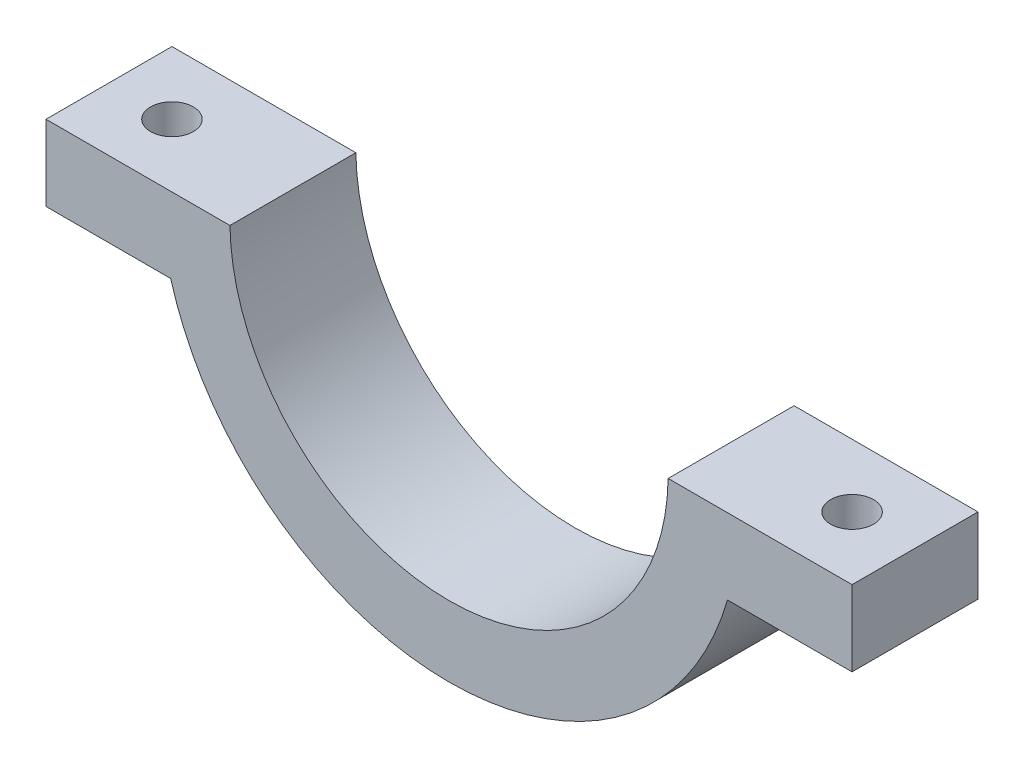
ISO-10303-21;
HEADER;
FILE_DESCRIPTION(('STEP AP214'),'2;1');
FILE_NAME('part.step','',(''),(''),'','','');
FILE_SCHEMA(('AUTOMOTIVE_DESIGN { 1 0 10303 214 1 1 1 1 }'));
ENDSEC;
DATA;
#1=APPLICATION_CONTEXT('core data for automotive mechanical design processes');
#2=APPLICATION_PROTOCOL_DEFINITION('international standard','automotive_design',2000,#1);
#3=PRODUCT_CONTEXT('',#1,'mechanical');
#4=PRODUCT('Part','Part','',(#3));
#5=PRODUCT_RELATED_PRODUCT_CATEGORY('part','',(#4));
#6=PRODUCT_DEFINITION_FORMATION('','',#4);
#7=PRODUCT_DEFINITION_CONTEXT('part definition',#1,'design');
#8=PRODUCT_DEFINITION('design','',#6,#7);
#9=PRODUCT_DEFINITION_SHAPE('','',#8);
#10=(LENGTH_UNIT() NAMED_UNIT(*) SI_UNIT(.MILLI.,.METRE.));
#11=(NAMED_UNIT(*) PLANE_ANGLE_UNIT() SI_UNIT($,.RADIAN.));
#12=(NAMED_UNIT(*) SI_UNIT($,.STERADIAN.) SOLID_ANGLE_UNIT());
#13=UNCERTAINTY_MEASURE_WITH_UNIT(LENGTH_MEASURE(1.E-05),#10,'distance_accuracy_value','');
#14=(GEOMETRIC_REPRESENTATION_CONTEXT(3) GLOBAL_UNCERTAINTY_ASSIGNED_CONTEXT((#13)) GLOBAL_UNIT_ASSIGNED_CONTEXT((#10,
#11,#12)) REPRESENTATION_CONTEXT('',''));
#15=CARTESIAN_POINT('',(0.,0.,0.));
#16=DIRECTION('',(0.,0.,1.));
#17=DIRECTION('',(1.,0.,0.));
#18=AXIS2_PLACEMENT_3D('',#15,#16,#17);
#19=CARTESIAN_POINT('',(32.,-0.3,10.));
#20=DIRECTION('',(0.,-1.,0.));
#21=DIRECTION('',(0.,0.,-1.));
#22=AXIS2_PLACEMENT_3D('',#19,#20,#21);
#23=PLANE('',#22);
#24=CARTESIAN_POINT('',(-27.,-0.3,5.));
#25=DIRECTION('',(0.,-1.,0.));
#26=DIRECTION('',(0.,0.,-1.));
#27=AXIS2_PLACEMENT_3D('',#24,#25,#26);
#28=CIRCLE('',#27,1.7);
#29=CARTESIAN_POINT('',(-27.,-0.3,3.3));
#30=VERTEX_POINT('',#29);
#31=EDGE_CURVE('E164',#30,#30,#28,.F.);
#32=ORIENTED_EDGE('',*,*,#31,.F.);
#33=EDGE_LOOP('',(#32));
#34=FACE_BOUND('',#33,.T.);
#35=DIRECTION('',(0.,0.,-1.));
#36=VECTOR('',#35,1.);
#37=CARTESIAN_POINT('',(-17.3974136008776,-0.3,10.2));
#38=LINE('',#37,#36);
#39=CARTESIAN_POINT('',(-17.3974136008776,-0.3,0.));
#40=VERTEX_POINT('',#39);
#41=CARTESIAN_POINT('',(-17.3974136008776,-0.3,10.));
#42=VERTEX_POINT('',#41);
#43=EDGE_CURVE('E168',#40,#42,#38,.F.);
#44=ORIENTED_EDGE('',*,*,#43,.F.);
#45=DIRECTION('',(-1.,0.,0.));
#46=VECTOR('',#45,1.);
#47=CARTESIAN_POINT('',(32.,-0.3,0.));
#48=LINE('',#47,#46);
#49=CARTESIAN_POINT('',(-32.,-0.3,0.));
#50=VERTEX_POINT('',#49);
#51=EDGE_CURVE('E139',#40,#50,#48,.T.);
#52=ORIENTED_EDGE('',*,*,#51,.T.);
#53=DIRECTION('',(0.,0.,-1.));
#54=VECTOR('',#53,1.);
#55=CARTESIAN_POINT('',(-32.,-0.3,10.));
#56=LINE('',#55,#54);
#57=CARTESIAN_POINT('',(-32.,-0.3,10.));
#58=VERTEX_POINT('',#57);
#59=EDGE_CURVE('E50',#58,#50,#56,.T.);
#60=ORIENTED_EDGE('',*,*,#59,.F.);
#61=DIRECTION('',(-1.,0.,0.));
#62=VECTOR('',#61,1.);
#63=CARTESIAN_POINT('',(32.,-0.3,10.));
#64=LINE('',#63,#62);
#65=EDGE_CURVE('E98',#42,#58,#64,.T.);
#66=ORIENTED_EDGE('',*,*,#65,.F.);
#67=EDGE_LOOP('',(#44,#52,#60,#66));
#68=FACE_BOUND('',#67,.T.);
#69=ADVANCED_FACE('F39',(#34,#68),#23,.F.);
#70=CARTESIAN_POINT('',(27.,-0.3,5.));
#71=DIRECTION('',(0.,-1.,0.));
#72=DIRECTION('',(0.,0.,-1.));
#73=AXIS2_PLACEMENT_3D('',#70,#71,#72);
#74=CIRCLE('',#73,1.7);
#75=CARTESIAN_POINT('',(27.,-0.3,3.3));
#76=VERTEX_POINT('',#75);
#77=EDGE_CURVE('E160',#76,#76,#74,.F.);
#78=ORIENTED_EDGE('',*,*,#77,.F.);
#79=EDGE_LOOP('',(#78));
#80=FACE_BOUND('',#79,.T.);
#81=DIRECTION('',(0.,0.,-1.));
#82=VECTOR('',#81,1.);
#83=CARTESIAN_POINT('',(17.3974136008776,-0.3,10.2));
#84=LINE('',#83,#82);
#85=CARTESIAN_POINT('',(17.3974136008776,-0.3,10.));
#86=VERTEX_POINT('',#85);
#87=CARTESIAN_POINT('',(17.3974136008776,-0.3,0.));
#88=VERTEX_POINT('',#87);
#89=EDGE_CURVE('E53',#86,#88,#84,.T.);
#90=ORIENTED_EDGE('',*,*,#89,.F.);
#91=CARTESIAN_POINT('',(32.,-0.3,10.));
#92=VERTEX_POINT('',#91);
#93=EDGE_CURVE('E171',#92,#86,#64,.T.);
#94=ORIENTED_EDGE('',*,*,#93,.F.);
#95=DIRECTION('',(0.,0.,-1.));
#96=VECTOR('',#95,1.);
#97=CARTESIAN_POINT('',(32.,-0.3,10.));
#98=LINE('',#97,#96);
#99=CARTESIAN_POINT('',(32.,-0.3,0.));
#100=VERTEX_POINT('',#99);
#101=EDGE_CURVE('E134',#92,#100,#98,.T.);
#102=ORIENTED_EDGE('',*,*,#101,.T.);
#103=EDGE_CURVE('E138',#100,#88,#48,.T.);
#104=ORIENTED_EDGE('',*,*,#103,.T.);
#105=EDGE_LOOP('',(#90,#94,#102,#104));
#106=FACE_BOUND('',#105,.T.);
#107=ADVANCED_FACE('F195',(#80,#106),#23,.F.);
#108=CARTESIAN_POINT('',(-32.,-0.3,10.));
#109=DIRECTION('',(1.,0.,0.));
#110=DIRECTION('',(0.,0.,-1.));
#111=AXIS2_PLACEMENT_3D('',#108,#109,#110);
#112=PLANE('',#111);
#113=DIRECTION('',(0.,-1.,0.));
#114=VECTOR('',#113,1.);
#115=CARTESIAN_POINT('',(-32.,-0.3,0.));
#116=LINE('',#115,#114);
#117=CARTESIAN_POINT('',(-32.,-6.3,0.));
#118=VERTEX_POINT('',#117);
#119=EDGE_CURVE('E137',#50,#118,#116,.T.);
#120=ORIENTED_EDGE('',*,*,#119,.T.);
#121=DIRECTION('',(0.,0.,-1.));
#122=VECTOR('',#121,1.);
#123=CARTESIAN_POINT('',(-32.,-6.3,10.));
#124=LINE('',#123,#122);
#125=CARTESIAN_POINT('',(-32.,-6.3,10.));
#126=VERTEX_POINT('',#125);
#127=EDGE_CURVE('E151',#126,#118,#124,.T.);
#128=ORIENTED_EDGE('',*,*,#127,.F.);
#129=DIRECTION('',(0.,-1.,0.));
#130=VECTOR('',#129,1.);
#131=CARTESIAN_POINT('',(-32.,-0.3,10.));
#132=LINE('',#131,#130);
#133=EDGE_CURVE('E180',#58,#126,#132,.T.);
#134=ORIENTED_EDGE('',*,*,#133,.F.);
#135=ORIENTED_EDGE('',*,*,#59,.T.);
#136=EDGE_LOOP('',(#120,#128,#134,#135));
#137=FACE_BOUND('',#136,.T.);
#138=ADVANCED_FACE('F182',(#137),#112,.F.);
#139=CARTESIAN_POINT('',(-32.,-6.3,10.));
#140=DIRECTION('',(0.,1.,0.));
#141=DIRECTION('',(0.,0.,1.));
#142=AXIS2_PLACEMENT_3D('',#139,#140,#141);
#143=PLANE('',#142);
#144=CARTESIAN_POINT('',(-27.,-6.3,5.));
#145=DIRECTION('',(0.,1.,0.));
#146=DIRECTION('',(0.,0.,1.));
#147=AXIS2_PLACEMENT_3D('',#144,#145,#146);
#148=CIRCLE('',#147,1.7);
#149=CARTESIAN_POINT('',(-27.,-6.3,6.7));
#150=VERTEX_POINT('',#149);
#151=EDGE_CURVE('E45',#150,#150,#148,.F.);
#152=ORIENTED_EDGE('',*,*,#151,.F.);
#153=EDGE_LOOP('',(#152));
#154=FACE_BOUND('',#153,.T.);
#155=DIRECTION('',(1.,0.,0.));
#156=VECTOR('',#155,1.);
#157=CARTESIAN_POINT('',(-32.,-6.3,0.));
#158=LINE('',#157,#156);
#159=CARTESIAN_POINT('',(-22.1,-6.3,0.));
#160=VERTEX_POINT('',#159);
#161=EDGE_CURVE('E142',#118,#160,#158,.T.);
#162=ORIENTED_EDGE('',*,*,#161,.T.);
#163=DIRECTION('',(0.,0.,-1.));
#164=VECTOR('',#163,1.);
#165=CARTESIAN_POINT('',(-22.1,-6.3,10.));
#166=LINE('',#165,#164);
#167=CARTESIAN_POINT('',(-22.1,-6.3,10.));
#168=VERTEX_POINT('',#167);
#169=EDGE_CURVE('E130',#168,#160,#166,.T.);
#170=ORIENTED_EDGE('',*,*,#169,.F.);
#171=DIRECTION('',(1.,0.,0.));
#172=VECTOR('',#171,1.);
#173=CARTESIAN_POINT('',(-32.,-6.3,10.));
#174=LINE('',#173,#172);
#175=EDGE_CURVE('E113',#126,#168,#174,.T.);
#176=ORIENTED_EDGE('',*,*,#175,.F.);
#177=ORIENTED_EDGE('',*,*,#127,.T.);
#178=EDGE_LOOP('',(#162,#170,#176,#177));
#179=FACE_BOUND('',#178,.T.);
#180=ADVANCED_FACE('F183',(#154,#179),#143,.F.);
#181=CARTESIAN_POINT('',(0.,-0.0269461077844271,10.));
#182=DIRECTION('',(0.,0.,-1.));
#183=DIRECTION('',(-1.,0.,0.));
#184=AXIS2_PLACEMENT_3D('',#181,#182,#183);
#185=CYLINDRICAL_SURFACE('',#184,22.9730538922156);
#186=CARTESIAN_POINT('',(0.,-0.0269461077844271,0.));
#187=DIRECTION('',(0.,0.,1.));
#188=DIRECTION('',(1.,0.,0.));
#189=AXIS2_PLACEMENT_3D('',#186,#187,#188);
#190=CIRCLE('',#189,22.9730538922156);
#191=CARTESIAN_POINT('',(22.1,-6.30000000000001,0.));
#192=VERTEX_POINT('',#191);
#193=EDGE_CURVE('E122',#160,#192,#190,.T.);
#194=ORIENTED_EDGE('',*,*,#193,.T.);
#195=DIRECTION('',(0.,0.,-1.));
#196=VECTOR('',#195,1.);
#197=CARTESIAN_POINT('',(22.1,-6.30000000000001,10.));
#198=LINE('',#197,#196);
#199=CARTESIAN_POINT('',(22.1,-6.30000000000001,10.));
#200=VERTEX_POINT('',#199);
#201=EDGE_CURVE('E123',#200,#192,#198,.T.);
#202=ORIENTED_EDGE('',*,*,#201,.F.);
#203=CARTESIAN_POINT('',(0.,-0.0269461077844271,10.));
#204=DIRECTION('',(0.,0.,1.));
#205=DIRECTION('',(1.,0.,0.));
#206=AXIS2_PLACEMENT_3D('',#203,#204,#205);
#207=CIRCLE('',#206,22.9730538922156);
#208=EDGE_CURVE('E107',#168,#200,#207,.T.);
#209=ORIENTED_EDGE('',*,*,#208,.F.);
#210=ORIENTED_EDGE('',*,*,#169,.T.);
#211=EDGE_LOOP('',(#194,#202,#209,#210));
#212=FACE_BOUND('',#211,.T.);
#213=ADVANCED_FACE('F125',(#212),#185,.T.);
#214=CARTESIAN_POINT('',(22.1,-6.3,10.));
#215=DIRECTION('',(0.,1.,0.));
#216=DIRECTION('',(0.,0.,1.));
#217=AXIS2_PLACEMENT_3D('',#214,#215,#216);
#218=PLANE('',#217);
#219=CARTESIAN_POINT('',(27.,-6.3,5.));
#220=DIRECTION('',(0.,1.,0.));
#221=DIRECTION('',(0.,0.,1.));
#222=AXIS2_PLACEMENT_3D('',#219,#220,#221);
#223=CIRCLE('',#222,1.7);
#224=CARTESIAN_POINT('',(27.,-6.3,6.7));
#225=VERTEX_POINT('',#224);
#226=EDGE_CURVE('E154',#225,#225,#223,.F.);
#227=ORIENTED_EDGE('',*,*,#226,.F.);
#228=EDGE_LOOP('',(#227));
#229=FACE_BOUND('',#228,.T.);
#230=DIRECTION('',(1.,0.,0.));
#231=VECTOR('',#230,1.);
#232=CARTESIAN_POINT('',(22.1,-6.3,0.));
#233=LINE('',#232,#231);
#234=CARTESIAN_POINT('',(32.,-6.3,0.));
#235=VERTEX_POINT('',#234);
#236=EDGE_CURVE('E144',#192,#235,#233,.T.);
#237=ORIENTED_EDGE('',*,*,#236,.T.);
#238=DIRECTION('',(0.,0.,-1.));
#239=VECTOR('',#238,1.);
#240=CARTESIAN_POINT('',(32.,-6.3,10.));
#241=LINE('',#240,#239);
#242=CARTESIAN_POINT('',(32.,-6.3,10.));
#243=VERTEX_POINT('',#242);
#244=EDGE_CURVE('E126',#243,#235,#241,.T.);
#245=ORIENTED_EDGE('',*,*,#244,.F.);
#246=DIRECTION('',(1.,0.,0.));
#247=VECTOR('',#246,1.);
#248=CARTESIAN_POINT('',(22.1,-6.3,10.));
#249=LINE('',#248,#247);
#250=EDGE_CURVE('E115',#200,#243,#249,.T.);
#251=ORIENTED_EDGE('',*,*,#250,.F.);
#252=ORIENTED_EDGE('',*,*,#201,.T.);
#253=EDGE_LOOP('',(#237,#245,#251,#252));
#254=FACE_BOUND('',#253,.T.);
#255=ADVANCED_FACE('F128',(#229,#254),#218,.F.);
#256=CARTESIAN_POINT('',(32.,-6.3,10.));
#257=DIRECTION('',(-1.,0.,0.));
#258=DIRECTION('',(0.,0.,1.));
#259=AXIS2_PLACEMENT_3D('',#256,#257,#258);
#260=PLANE('',#259);
#261=DIRECTION('',(0.,1.,0.));
#262=VECTOR('',#261,1.);
#263=CARTESIAN_POINT('',(32.,-6.3,0.));
#264=LINE('',#263,#262);
#265=EDGE_CURVE('E89',#235,#100,#264,.T.);
#266=ORIENTED_EDGE('',*,*,#265,.T.);
#267=ORIENTED_EDGE('',*,*,#101,.F.);
#268=DIRECTION('',(0.,1.,0.));
#269=VECTOR('',#268,1.);
#270=CARTESIAN_POINT('',(32.,-6.3,10.));
#271=LINE('',#270,#269);
#272=EDGE_CURVE('E62',#243,#92,#271,.T.);
#273=ORIENTED_EDGE('',*,*,#272,.F.);
#274=ORIENTED_EDGE('',*,*,#244,.T.);
#275=EDGE_LOOP('',(#266,#267,#273,#274));
#276=FACE_BOUND('',#275,.T.);
#277=ADVANCED_FACE('F190',(#276),#260,.F.);
#278=CARTESIAN_POINT('',(0.,-0.0269461077844271,10.));
#279=DIRECTION('',(0.,0.,1.));
#280=DIRECTION('',(1.,0.,0.));
#281=AXIS2_PLACEMENT_3D('',#278,#279,#280);
#282=PLANE('',#281);
#283=ORIENTED_EDGE('',*,*,#93,.T.);
#284=CARTESIAN_POINT('',(0.,0.,10.));
#285=DIRECTION('',(0.,0.,1.));
#286=DIRECTION('',(1.,0.,0.));
#287=AXIS2_PLACEMENT_3D('',#284,#285,#286);
#288=CIRCLE('',#287,17.4);
#289=EDGE_CURVE('E172',#86,#42,#288,.F.);
#290=ORIENTED_EDGE('',*,*,#289,.T.);
#291=ORIENTED_EDGE('',*,*,#65,.T.);
#292=ORIENTED_EDGE('',*,*,#133,.T.);
#293=ORIENTED_EDGE('',*,*,#175,.T.);
#294=ORIENTED_EDGE('',*,*,#208,.T.);
#295=ORIENTED_EDGE('',*,*,#250,.T.);
#296=ORIENTED_EDGE('',*,*,#272,.T.);
#297=EDGE_LOOP('',(#283,#290,#291,#292,#293,#294,#295,#296));
#298=FACE_BOUND('',#297,.T.);
#299=ADVANCED_FACE('F109',(#298),#282,.T.);
#300=CARTESIAN_POINT('',(0.,-0.0269461077844271,0.));
#301=DIRECTION('',(0.,0.,1.));
#302=DIRECTION('',(1.,0.,0.));
#303=AXIS2_PLACEMENT_3D('',#300,#301,#302);
#304=PLANE('',#303);
#305=CARTESIAN_POINT('',(0.,0.,0.));
#306=DIRECTION('',(0.,0.,1.));
#307=DIRECTION('',(1.,0.,0.));
#308=AXIS2_PLACEMENT_3D('',#305,#306,#307);
#309=CIRCLE('',#308,17.4);
#310=EDGE_CURVE('E11',#88,#40,#309,.F.);
#311=ORIENTED_EDGE('',*,*,#310,.F.);
#312=ORIENTED_EDGE('',*,*,#103,.F.);
#313=ORIENTED_EDGE('',*,*,#265,.F.);
#314=ORIENTED_EDGE('',*,*,#236,.F.);
#315=ORIENTED_EDGE('',*,*,#193,.F.);
#316=ORIENTED_EDGE('',*,*,#161,.F.);
#317=ORIENTED_EDGE('',*,*,#119,.F.);
#318=ORIENTED_EDGE('',*,*,#51,.F.);
#319=EDGE_LOOP('',(#311,#312,#313,#314,#315,#316,#317,#318));
#320=FACE_BOUND('',#319,.T.);
#321=ADVANCED_FACE('F189',(#320),#304,.F.);
#322=CARTESIAN_POINT('',(0.,0.,10.2));
#323=DIRECTION('',(0.,0.,-1.));
#324=DIRECTION('',(-1.,0.,0.));
#325=AXIS2_PLACEMENT_3D('',#322,#323,#324);
#326=CYLINDRICAL_SURFACE('',#325,17.4);
#327=ORIENTED_EDGE('',*,*,#89,.T.);
#328=ORIENTED_EDGE('',*,*,#310,.T.);
#329=ORIENTED_EDGE('',*,*,#43,.T.);
#330=ORIENTED_EDGE('',*,*,#289,.F.);
#331=EDGE_LOOP('',(#327,#328,#329,#330));
#332=FACE_BOUND('',#331,.T.);
#333=ADVANCED_FACE('F197',(#332),#326,.F.);
#334=CARTESIAN_POINT('',(27.,0.2,5.));
#335=DIRECTION('',(0.,-1.,0.));
#336=DIRECTION('',(0.,0.,-1.));
#337=AXIS2_PLACEMENT_3D('',#334,#335,#336);
#338=CYLINDRICAL_SURFACE('',#337,1.7);
#339=ORIENTED_EDGE('',*,*,#226,.T.);
#340=EDGE_LOOP('',(#339));
#341=FACE_BOUND('',#340,.T.);
#342=ORIENTED_EDGE('',*,*,#77,.T.);
#343=EDGE_LOOP('',(#342));
#344=FACE_BOUND('',#343,.T.);
#345=ADVANCED_FACE('F211',(#341,#344),#338,.F.);
#346=CARTESIAN_POINT('',(-27.,0.2,5.));
#347=DIRECTION('',(0.,-1.,0.));
#348=DIRECTION('',(0.,0.,-1.));
#349=AXIS2_PLACEMENT_3D('',#346,#347,#348);
#350=CYLINDRICAL_SURFACE('',#349,1.7);
#351=ORIENTED_EDGE('',*,*,#151,.T.);
#352=EDGE_LOOP('',(#351));
#353=FACE_BOUND('',#352,.T.);
#354=ORIENTED_EDGE('',*,*,#31,.T.);
#355=EDGE_LOOP('',(#354));
#356=FACE_BOUND('',#355,.T.);
#357=ADVANCED_FACE('F207',(#353,#356),#350,.F.);
#358=CLOSED_SHELL('',(#69,#107,#138,#180,#213,#255,#277,#299,#321,#333,#345,#357));
#359=MANIFOLD_SOLID_BREP('B2',#358);
#360=ADVANCED_BREP_SHAPE_REPRESENTATION('',(#18,#359),#14);
#361=SHAPE_DEFINITION_REPRESENTATION(#9,#360);
ENDSEC;
END-ISO-10303-21;
